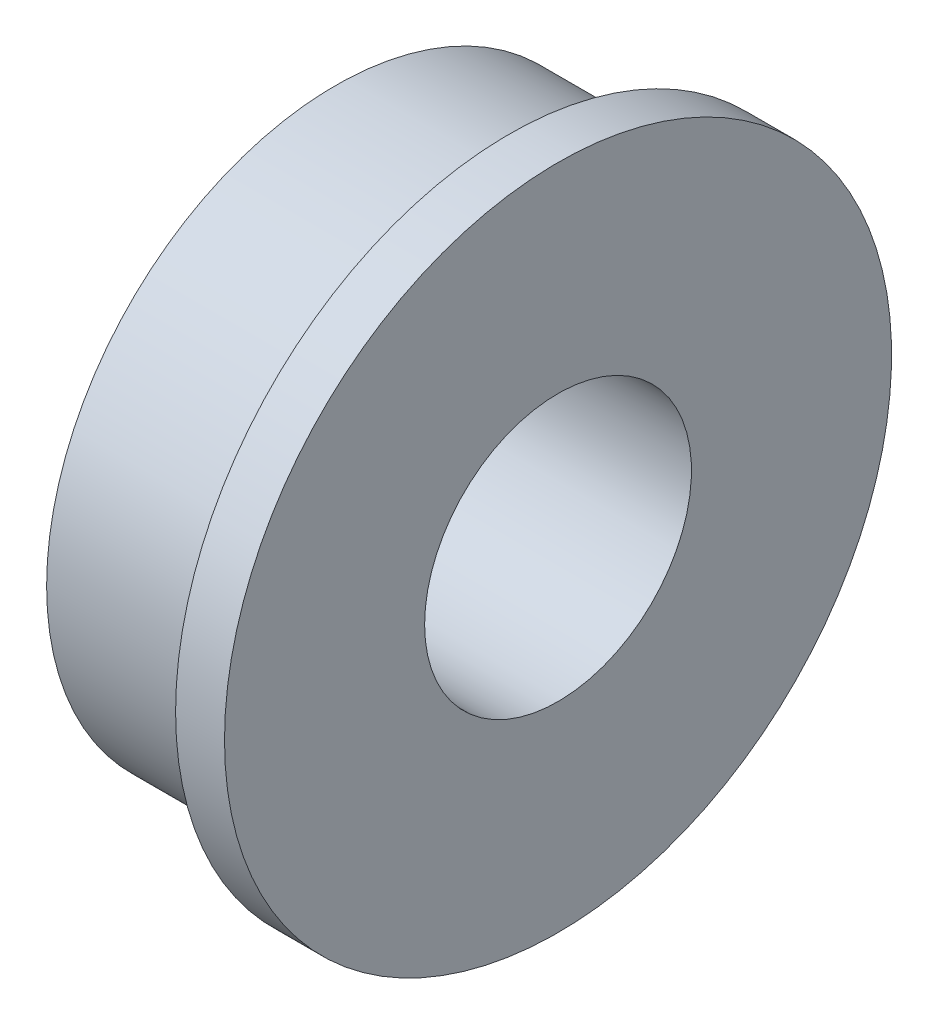
ISO-10303-21;
HEADER;
FILE_DESCRIPTION(('STEP AP214'),'2;1');
FILE_NAME('part.step','',(''),(''),'','','');
FILE_SCHEMA(('AUTOMOTIVE_DESIGN { 1 0 10303 214 1 1 1 1 }'));
ENDSEC;
DATA;
#1=APPLICATION_CONTEXT('core data for automotive mechanical design processes');
#2=APPLICATION_PROTOCOL_DEFINITION('international standard','automotive_design',2000,#1);
#3=PRODUCT_CONTEXT('',#1,'mechanical');
#4=PRODUCT('Part','Part','',(#3));
#5=PRODUCT_RELATED_PRODUCT_CATEGORY('part','',(#4));
#6=PRODUCT_DEFINITION_FORMATION('','',#4);
#7=PRODUCT_DEFINITION_CONTEXT('part definition',#1,'design');
#8=PRODUCT_DEFINITION('design','',#6,#7);
#9=PRODUCT_DEFINITION_SHAPE('','',#8);
#10=(LENGTH_UNIT() NAMED_UNIT(*) SI_UNIT(.MILLI.,.METRE.));
#11=(NAMED_UNIT(*) PLANE_ANGLE_UNIT() SI_UNIT($,.RADIAN.));
#12=(NAMED_UNIT(*) SI_UNIT($,.STERADIAN.) SOLID_ANGLE_UNIT());
#13=UNCERTAINTY_MEASURE_WITH_UNIT(LENGTH_MEASURE(1.E-05),#10,'distance_accuracy_value','');
#14=(GEOMETRIC_REPRESENTATION_CONTEXT(3) GLOBAL_UNCERTAINTY_ASSIGNED_CONTEXT((#13)) GLOBAL_UNIT_ASSIGNED_CONTEXT((#10,
#11,#12)) REPRESENTATION_CONTEXT('',''));
#15=CARTESIAN_POINT('',(0.,0.,0.));
#16=DIRECTION('',(0.,0.,1.));
#17=DIRECTION('',(1.,0.,0.));
#18=AXIS2_PLACEMENT_3D('',#15,#16,#17);
#19=CARTESIAN_POINT('',(-46.8648648648649,0.,0.));
#20=DIRECTION('',(-1.,0.,0.));
#21=DIRECTION('',(0.,0.,1.));
#22=AXIS2_PLACEMENT_3D('',#19,#20,#21);
#23=CYLINDRICAL_SURFACE('',#22,7.5);
#24=CARTESIAN_POINT('',(-1.1,0.,0.));
#25=DIRECTION('',(-1.,0.,0.));
#26=DIRECTION('',(0.,0.,1.));
#27=AXIS2_PLACEMENT_3D('',#24,#25,#26);
#28=CIRCLE('',#27,7.5);
#29=CARTESIAN_POINT('',(-1.1,0.,7.5));
#30=VERTEX_POINT('',#29);
#31=EDGE_CURVE('E10',#30,#30,#28,.T.);
#32=ORIENTED_EDGE('',*,*,#31,.F.);
#33=EDGE_LOOP('',(#32));
#34=FACE_BOUND('',#33,.T.);
#35=CARTESIAN_POINT('',(0.,0.,0.));
#36=DIRECTION('',(-1.,0.,0.));
#37=DIRECTION('',(0.,0.,1.));
#38=AXIS2_PLACEMENT_3D('',#35,#36,#37);
#39=CIRCLE('',#38,7.5);
#40=CARTESIAN_POINT('',(0.,0.,7.5));
#41=VERTEX_POINT('',#40);
#42=EDGE_CURVE('E55',#41,#41,#39,.T.);
#43=ORIENTED_EDGE('',*,*,#42,.T.);
#44=EDGE_LOOP('',(#43));
#45=FACE_BOUND('',#44,.T.);
#46=ADVANCED_FACE('F33',(#34,#45),#23,.T.);
#47=CARTESIAN_POINT('',(-1.1,7.5,0.));
#48=DIRECTION('',(1.,0.,0.));
#49=DIRECTION('',(0.,0.,-1.));
#50=AXIS2_PLACEMENT_3D('',#47,#48,#49);
#51=PLANE('',#50);
#52=CARTESIAN_POINT('',(-1.1,0.,0.));
#53=DIRECTION('',(-1.,0.,0.));
#54=DIRECTION('',(0.,0.,1.));
#55=AXIS2_PLACEMENT_3D('',#52,#53,#54);
#56=CIRCLE('',#55,6.5);
#57=CARTESIAN_POINT('',(-1.1,0.,6.5));
#58=VERTEX_POINT('',#57);
#59=EDGE_CURVE('E39',#58,#58,#56,.T.);
#60=ORIENTED_EDGE('',*,*,#59,.F.);
#61=EDGE_LOOP('',(#60));
#62=FACE_BOUND('',#61,.T.);
#63=ORIENTED_EDGE('',*,*,#31,.T.);
#64=EDGE_LOOP('',(#63));
#65=FACE_BOUND('',#64,.T.);
#66=ADVANCED_FACE('F80',(#62,#65),#51,.F.);
#67=CARTESIAN_POINT('',(-46.8648648648649,0.,0.));
#68=DIRECTION('',(-1.,0.,0.));
#69=DIRECTION('',(0.,0.,1.));
#70=AXIS2_PLACEMENT_3D('',#67,#68,#69);
#71=CYLINDRICAL_SURFACE('',#70,6.5);
#72=CARTESIAN_POINT('',(-5.,0.,0.));
#73=DIRECTION('',(-1.,0.,0.));
#74=DIRECTION('',(0.,0.,1.));
#75=AXIS2_PLACEMENT_3D('',#72,#73,#74);
#76=CIRCLE('',#75,6.5);
#77=CARTESIAN_POINT('',(-5.,0.,6.5));
#78=VERTEX_POINT('',#77);
#79=EDGE_CURVE('E43',#78,#78,#76,.T.);
#80=ORIENTED_EDGE('',*,*,#79,.F.);
#81=EDGE_LOOP('',(#80));
#82=FACE_BOUND('',#81,.T.);
#83=ORIENTED_EDGE('',*,*,#59,.T.);
#84=EDGE_LOOP('',(#83));
#85=FACE_BOUND('',#84,.T.);
#86=ADVANCED_FACE('F75',(#82,#85),#71,.T.);
#87=CARTESIAN_POINT('',(-5.,6.5,0.));
#88=DIRECTION('',(1.,0.,0.));
#89=DIRECTION('',(0.,0.,-1.));
#90=AXIS2_PLACEMENT_3D('',#87,#88,#89);
#91=PLANE('',#90);
#92=CARTESIAN_POINT('',(-5.,0.,0.));
#93=DIRECTION('',(-1.,0.,0.));
#94=DIRECTION('',(0.,0.,1.));
#95=AXIS2_PLACEMENT_3D('',#92,#93,#94);
#96=CIRCLE('',#95,3.);
#97=CARTESIAN_POINT('',(-5.,0.,3.));
#98=VERTEX_POINT('',#97);
#99=EDGE_CURVE('E47',#98,#98,#96,.T.);
#100=ORIENTED_EDGE('',*,*,#99,.F.);
#101=EDGE_LOOP('',(#100));
#102=FACE_BOUND('',#101,.T.);
#103=ORIENTED_EDGE('',*,*,#79,.T.);
#104=EDGE_LOOP('',(#103));
#105=FACE_BOUND('',#104,.T.);
#106=ADVANCED_FACE('F69',(#102,#105),#91,.F.);
#107=CARTESIAN_POINT('',(-46.8648648648649,0.,0.));
#108=DIRECTION('',(-1.,0.,0.));
#109=DIRECTION('',(0.,0.,1.));
#110=AXIS2_PLACEMENT_3D('',#107,#108,#109);
#111=CYLINDRICAL_SURFACE('',#110,3.);
#112=CARTESIAN_POINT('',(0.,0.,0.));
#113=DIRECTION('',(-1.,0.,0.));
#114=DIRECTION('',(0.,0.,1.));
#115=AXIS2_PLACEMENT_3D('',#112,#113,#114);
#116=CIRCLE('',#115,3.);
#117=CARTESIAN_POINT('',(0.,0.,3.));
#118=VERTEX_POINT('',#117);
#119=EDGE_CURVE('E52',#118,#118,#116,.T.);
#120=ORIENTED_EDGE('',*,*,#119,.F.);
#121=EDGE_LOOP('',(#120));
#122=FACE_BOUND('',#121,.T.);
#123=ORIENTED_EDGE('',*,*,#99,.T.);
#124=EDGE_LOOP('',(#123));
#125=FACE_BOUND('',#124,.T.);
#126=ADVANCED_FACE('F63',(#122,#125),#111,.F.);
#127=CARTESIAN_POINT('',(0.,7.5,0.));
#128=DIRECTION('',(-1.,0.,0.));
#129=DIRECTION('',(0.,0.,1.));
#130=AXIS2_PLACEMENT_3D('',#127,#128,#129);
#131=PLANE('',#130);
#132=ORIENTED_EDGE('',*,*,#42,.F.);
#133=EDGE_LOOP('',(#132));
#134=FACE_BOUND('',#133,.T.);
#135=ORIENTED_EDGE('',*,*,#119,.T.);
#136=EDGE_LOOP('',(#135));
#137=FACE_BOUND('',#136,.T.);
#138=ADVANCED_FACE('F60',(#134,#137),#131,.F.);
#139=CLOSED_SHELL('',(#46,#66,#86,#106,#126,#138));
#140=MANIFOLD_SOLID_BREP('B2',#139);
#141=ADVANCED_BREP_SHAPE_REPRESENTATION('',(#18,#140),#14);
#142=SHAPE_DEFINITION_REPRESENTATION(#9,#141);
ENDSEC;
END-ISO-10303-21;
